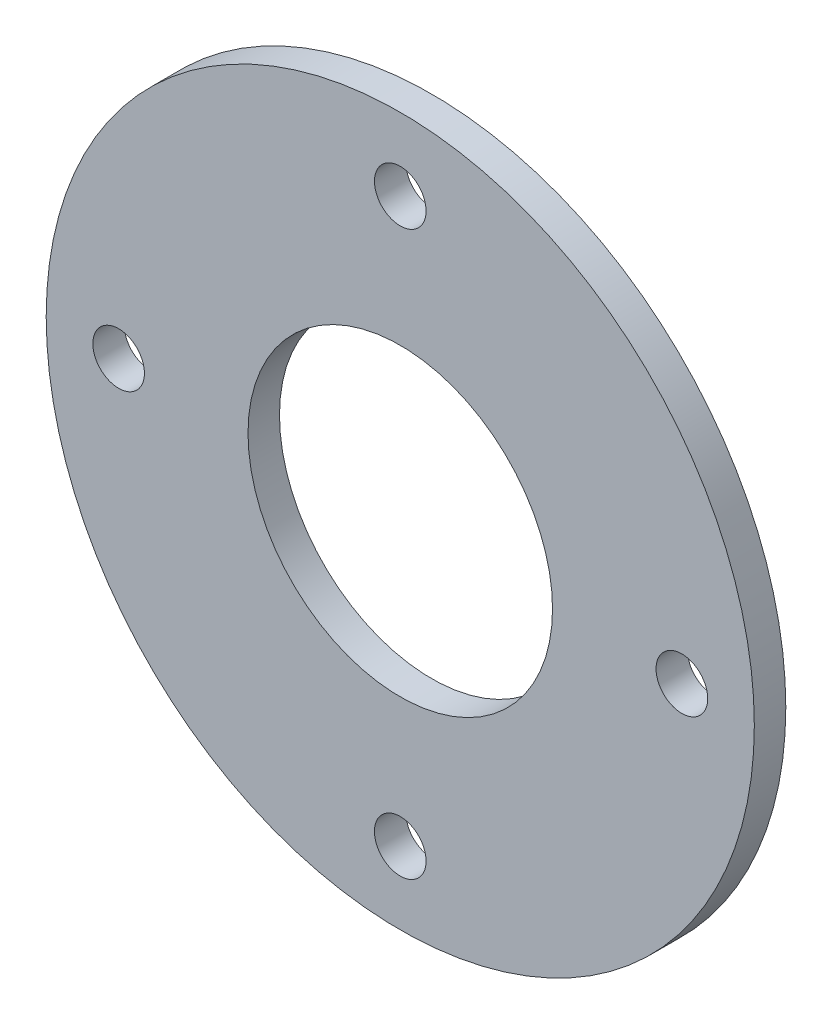
ISO-10303-21;
HEADER;
FILE_DESCRIPTION(('STEP AP214'),'2;1');
FILE_NAME('part.step','',(''),(''),'','','');
FILE_SCHEMA(('AUTOMOTIVE_DESIGN { 1 0 10303 214 1 1 1 1 }'));
ENDSEC;
DATA;
#1=APPLICATION_CONTEXT('core data for automotive mechanical design processes');
#2=APPLICATION_PROTOCOL_DEFINITION('international standard','automotive_design',2000,#1);
#3=PRODUCT_CONTEXT('',#1,'mechanical');
#4=PRODUCT('Part','Part','',(#3));
#5=PRODUCT_RELATED_PRODUCT_CATEGORY('part','',(#4));
#6=PRODUCT_DEFINITION_FORMATION('','',#4);
#7=PRODUCT_DEFINITION_CONTEXT('part definition',#1,'design');
#8=PRODUCT_DEFINITION('design','',#6,#7);
#9=PRODUCT_DEFINITION_SHAPE('','',#8);
#10=(LENGTH_UNIT() NAMED_UNIT(*) SI_UNIT(.MILLI.,.METRE.));
#11=(NAMED_UNIT(*) PLANE_ANGLE_UNIT() SI_UNIT($,.RADIAN.));
#12=(NAMED_UNIT(*) SI_UNIT($,.STERADIAN.) SOLID_ANGLE_UNIT());
#13=UNCERTAINTY_MEASURE_WITH_UNIT(LENGTH_MEASURE(1.E-05),#10,'distance_accuracy_value','');
#14=(GEOMETRIC_REPRESENTATION_CONTEXT(3) GLOBAL_UNCERTAINTY_ASSIGNED_CONTEXT((#13)) GLOBAL_UNIT_ASSIGNED_CONTEXT((#10,
#11,#12)) REPRESENTATION_CONTEXT('',''));
#15=CARTESIAN_POINT('',(0.,0.,0.));
#16=DIRECTION('',(0.,0.,1.));
#17=DIRECTION('',(1.,0.,0.));
#18=AXIS2_PLACEMENT_3D('',#15,#16,#17);
#19=CARTESIAN_POINT('',(0.,0.,10.16));
#20=DIRECTION('',(0.,0.,1.));
#21=DIRECTION('',(1.,0.,0.));
#22=AXIS2_PLACEMENT_3D('',#19,#20,#21);
#23=PLANE('',#22);
#24=CARTESIAN_POINT('',(0.,90.8527596999048,10.16));
#25=DIRECTION('',(0.,0.,-1.));
#26=DIRECTION('',(-1.,0.,0.));
#27=AXIS2_PLACEMENT_3D('',#24,#25,#26);
#28=CIRCLE('',#27,8.33373999999998);
#29=CARTESIAN_POINT('',(-8.33373999999998,90.8527596999048,10.16));
#30=VERTEX_POINT('',#29);
#31=EDGE_CURVE('E94',#30,#30,#28,.T.);
#32=ORIENTED_EDGE('',*,*,#31,.T.);
#33=EDGE_LOOP('',(#32));
#34=FACE_BOUND('',#33,.T.);
#35=CARTESIAN_POINT('',(-90.9113801471292,0.,10.16));
#36=DIRECTION('',(0.,0.,-1.));
#37=DIRECTION('',(-1.,0.,0.));
#38=AXIS2_PLACEMENT_3D('',#35,#36,#37);
#39=CIRCLE('',#38,8.33373999999999);
#40=CARTESIAN_POINT('',(-99.2451201471292,0.,10.16));
#41=VERTEX_POINT('',#40);
#42=EDGE_CURVE('E86',#41,#41,#39,.T.);
#43=ORIENTED_EDGE('',*,*,#42,.T.);
#44=EDGE_LOOP('',(#43));
#45=FACE_BOUND('',#44,.T.);
#46=CARTESIAN_POINT('',(0.,-90.9113801471292,10.16));
#47=DIRECTION('',(0.,0.,-1.));
#48=DIRECTION('',(-1.,0.,0.));
#49=AXIS2_PLACEMENT_3D('',#46,#47,#48);
#50=CIRCLE('',#49,8.33373999999998);
#51=CARTESIAN_POINT('',(-8.33373999999998,-90.9113801471292,10.16));
#52=VERTEX_POINT('',#51);
#53=EDGE_CURVE('E76',#52,#52,#50,.T.);
#54=ORIENTED_EDGE('',*,*,#53,.T.);
#55=EDGE_LOOP('',(#54));
#56=FACE_BOUND('',#55,.T.);
#57=CARTESIAN_POINT('',(90.9113801471292,0.,10.16));
#58=DIRECTION('',(0.,0.,-1.));
#59=DIRECTION('',(-1.,0.,0.));
#60=AXIS2_PLACEMENT_3D('',#57,#58,#59);
#61=CIRCLE('',#60,8.33373999999998);
#62=CARTESIAN_POINT('',(82.5776401471292,0.,10.16));
#63=VERTEX_POINT('',#62);
#64=EDGE_CURVE('E70',#63,#63,#61,.T.);
#65=ORIENTED_EDGE('',*,*,#64,.T.);
#66=EDGE_LOOP('',(#65));
#67=FACE_BOUND('',#66,.T.);
#68=CARTESIAN_POINT('',(0.,0.,10.16));
#69=DIRECTION('',(0.,0.,1.));
#70=DIRECTION('',(1.,0.,0.));
#71=AXIS2_PLACEMENT_3D('',#68,#69,#70);
#72=CIRCLE('',#71,114.3);
#73=CARTESIAN_POINT('',(114.3,0.,10.16));
#74=VERTEX_POINT('',#73);
#75=EDGE_CURVE('E10',#74,#74,#72,.T.);
#76=ORIENTED_EDGE('',*,*,#75,.T.);
#77=EDGE_LOOP('',(#76));
#78=FACE_BOUND('',#77,.T.);
#79=CARTESIAN_POINT('',(0.,0.,10.16));
#80=DIRECTION('',(0.,0.,1.));
#81=DIRECTION('',(1.,0.,0.));
#82=AXIS2_PLACEMENT_3D('',#79,#80,#81);
#83=CIRCLE('',#82,49.1499994635115);
#84=CARTESIAN_POINT('',(49.1499994635115,0.,10.16));
#85=VERTEX_POINT('',#84);
#86=EDGE_CURVE('E59',#85,#85,#83,.T.);
#87=ORIENTED_EDGE('',*,*,#86,.F.);
#88=EDGE_LOOP('',(#87));
#89=FACE_BOUND('',#88,.T.);
#90=ADVANCED_FACE('F43',(#34,#45,#56,#67,#78,#89),#23,.T.);
#91=CARTESIAN_POINT('',(0.,0.,0.));
#92=DIRECTION('',(0.,0.,1.));
#93=DIRECTION('',(1.,0.,0.));
#94=AXIS2_PLACEMENT_3D('',#91,#92,#93);
#95=PLANE('',#94);
#96=CARTESIAN_POINT('',(0.,90.8527596999048,0.));
#97=DIRECTION('',(0.,0.,-1.));
#98=DIRECTION('',(-1.,0.,0.));
#99=AXIS2_PLACEMENT_3D('',#96,#97,#98);
#100=CIRCLE('',#99,8.33373999999999);
#101=CARTESIAN_POINT('',(-8.33373999999999,90.8527596999048,0.));
#102=VERTEX_POINT('',#101);
#103=EDGE_CURVE('E90',#102,#102,#100,.T.);
#104=ORIENTED_EDGE('',*,*,#103,.F.);
#105=EDGE_LOOP('',(#104));
#106=FACE_BOUND('',#105,.T.);
#107=CARTESIAN_POINT('',(-90.9113801471292,0.,0.));
#108=DIRECTION('',(0.,0.,-1.));
#109=DIRECTION('',(-1.,0.,0.));
#110=AXIS2_PLACEMENT_3D('',#107,#108,#109);
#111=CIRCLE('',#110,8.33373999999999);
#112=CARTESIAN_POINT('',(-99.2451201471292,0.,0.));
#113=VERTEX_POINT('',#112);
#114=EDGE_CURVE('E85',#113,#113,#111,.T.);
#115=ORIENTED_EDGE('',*,*,#114,.F.);
#116=EDGE_LOOP('',(#115));
#117=FACE_BOUND('',#116,.T.);
#118=CARTESIAN_POINT('',(0.,-90.9113801471292,0.));
#119=DIRECTION('',(0.,0.,-1.));
#120=DIRECTION('',(-1.,0.,0.));
#121=AXIS2_PLACEMENT_3D('',#118,#119,#120);
#122=CIRCLE('',#121,8.33373999999999);
#123=CARTESIAN_POINT('',(-8.33373999999999,-90.9113801471292,0.));
#124=VERTEX_POINT('',#123);
#125=EDGE_CURVE('E74',#124,#124,#122,.T.);
#126=ORIENTED_EDGE('',*,*,#125,.F.);
#127=EDGE_LOOP('',(#126));
#128=FACE_BOUND('',#127,.T.);
#129=CARTESIAN_POINT('',(90.9113801471292,0.,0.));
#130=DIRECTION('',(0.,0.,-1.));
#131=DIRECTION('',(-1.,0.,0.));
#132=AXIS2_PLACEMENT_3D('',#129,#130,#131);
#133=CIRCLE('',#132,8.33373999999999);
#134=CARTESIAN_POINT('',(82.5776401471292,0.,0.));
#135=VERTEX_POINT('',#134);
#136=EDGE_CURVE('E63',#135,#135,#133,.T.);
#137=ORIENTED_EDGE('',*,*,#136,.F.);
#138=EDGE_LOOP('',(#137));
#139=FACE_BOUND('',#138,.T.);
#140=CARTESIAN_POINT('',(0.,0.,0.));
#141=DIRECTION('',(0.,0.,1.));
#142=DIRECTION('',(1.,0.,0.));
#143=AXIS2_PLACEMENT_3D('',#140,#141,#142);
#144=CIRCLE('',#143,114.3);
#145=CARTESIAN_POINT('',(114.3,0.,0.));
#146=VERTEX_POINT('',#145);
#147=EDGE_CURVE('E50',#146,#146,#144,.T.);
#148=ORIENTED_EDGE('',*,*,#147,.F.);
#149=EDGE_LOOP('',(#148));
#150=FACE_BOUND('',#149,.T.);
#151=CARTESIAN_POINT('',(0.,0.,0.));
#152=DIRECTION('',(0.,0.,1.));
#153=DIRECTION('',(1.,0.,0.));
#154=AXIS2_PLACEMENT_3D('',#151,#152,#153);
#155=CIRCLE('',#154,49.1499994635115);
#156=CARTESIAN_POINT('',(49.1499994635115,0.,0.));
#157=VERTEX_POINT('',#156);
#158=EDGE_CURVE('E58',#157,#157,#155,.T.);
#159=ORIENTED_EDGE('',*,*,#158,.T.);
#160=EDGE_LOOP('',(#159));
#161=FACE_BOUND('',#160,.T.);
#162=ADVANCED_FACE('F107',(#106,#117,#128,#139,#150,#161),#95,.F.);
#163=CARTESIAN_POINT('',(0.,0.,10.16));
#164=DIRECTION('',(0.,0.,-1.));
#165=DIRECTION('',(-1.,0.,0.));
#166=AXIS2_PLACEMENT_3D('',#163,#164,#165);
#167=CYLINDRICAL_SURFACE('',#166,114.3);
#168=ORIENTED_EDGE('',*,*,#75,.F.);
#169=EDGE_LOOP('',(#168));
#170=FACE_BOUND('',#169,.T.);
#171=ORIENTED_EDGE('',*,*,#147,.T.);
#172=EDGE_LOOP('',(#171));
#173=FACE_BOUND('',#172,.T.);
#174=ADVANCED_FACE('F44',(#170,#173),#167,.T.);
#175=CARTESIAN_POINT('',(0.,0.,10.16));
#176=DIRECTION('',(0.,0.,-1.));
#177=DIRECTION('',(-1.,0.,0.));
#178=AXIS2_PLACEMENT_3D('',#175,#176,#177);
#179=CYLINDRICAL_SURFACE('',#178,49.1499994635115);
#180=ORIENTED_EDGE('',*,*,#86,.T.);
#181=EDGE_LOOP('',(#180));
#182=FACE_BOUND('',#181,.T.);
#183=ORIENTED_EDGE('',*,*,#158,.F.);
#184=EDGE_LOOP('',(#183));
#185=FACE_BOUND('',#184,.T.);
#186=ADVANCED_FACE('F125',(#182,#185),#179,.F.);
#187=CARTESIAN_POINT('',(90.9113801471292,0.,0.));
#188=DIRECTION('',(0.,0.,-1.));
#189=DIRECTION('',(-1.,0.,0.));
#190=AXIS2_PLACEMENT_3D('',#187,#188,#189);
#191=CYLINDRICAL_SURFACE('',#190,8.33373999999998);
#192=ORIENTED_EDGE('',*,*,#64,.F.);
#193=EDGE_LOOP('',(#192));
#194=FACE_BOUND('',#193,.T.);
#195=ORIENTED_EDGE('',*,*,#136,.T.);
#196=EDGE_LOOP('',(#195));
#197=FACE_BOUND('',#196,.T.);
#198=ADVANCED_FACE('F121',(#194,#197),#191,.F.);
#199=CARTESIAN_POINT('',(0.,-90.9113801471292,0.));
#200=DIRECTION('',(0.,0.,-1.));
#201=DIRECTION('',(-1.,0.,0.));
#202=AXIS2_PLACEMENT_3D('',#199,#200,#201);
#203=CYLINDRICAL_SURFACE('',#202,8.33373999999998);
#204=ORIENTED_EDGE('',*,*,#53,.F.);
#205=EDGE_LOOP('',(#204));
#206=FACE_BOUND('',#205,.T.);
#207=ORIENTED_EDGE('',*,*,#125,.T.);
#208=EDGE_LOOP('',(#207));
#209=FACE_BOUND('',#208,.T.);
#210=ADVANCED_FACE('F132',(#206,#209),#203,.F.);
#211=CARTESIAN_POINT('',(-90.9113801471292,0.,0.));
#212=DIRECTION('',(0.,0.,-1.));
#213=DIRECTION('',(-1.,0.,0.));
#214=AXIS2_PLACEMENT_3D('',#211,#212,#213);
#215=CYLINDRICAL_SURFACE('',#214,8.33373999999999);
#216=ORIENTED_EDGE('',*,*,#42,.F.);
#217=EDGE_LOOP('',(#216));
#218=FACE_BOUND('',#217,.T.);
#219=ORIENTED_EDGE('',*,*,#114,.T.);
#220=EDGE_LOOP('',(#219));
#221=FACE_BOUND('',#220,.T.);
#222=ADVANCED_FACE('F102',(#218,#221),#215,.F.);
#223=CARTESIAN_POINT('',(0.,90.8527596999048,0.));
#224=DIRECTION('',(0.,0.,-1.));
#225=DIRECTION('',(-1.,0.,0.));
#226=AXIS2_PLACEMENT_3D('',#223,#224,#225);
#227=CYLINDRICAL_SURFACE('',#226,8.33373999999998);
#228=ORIENTED_EDGE('',*,*,#31,.F.);
#229=EDGE_LOOP('',(#228));
#230=FACE_BOUND('',#229,.T.);
#231=ORIENTED_EDGE('',*,*,#103,.T.);
#232=EDGE_LOOP('',(#231));
#233=FACE_BOUND('',#232,.T.);
#234=ADVANCED_FACE('F105',(#230,#233),#227,.F.);
#235=CLOSED_SHELL('',(#90,#162,#174,#186,#198,#210,#222,#234));
#236=MANIFOLD_SOLID_BREP('B2',#235);
#237=ADVANCED_BREP_SHAPE_REPRESENTATION('',(#18,#236),#14);
#238=SHAPE_DEFINITION_REPRESENTATION(#9,#237);
ENDSEC;
END-ISO-10303-21;
